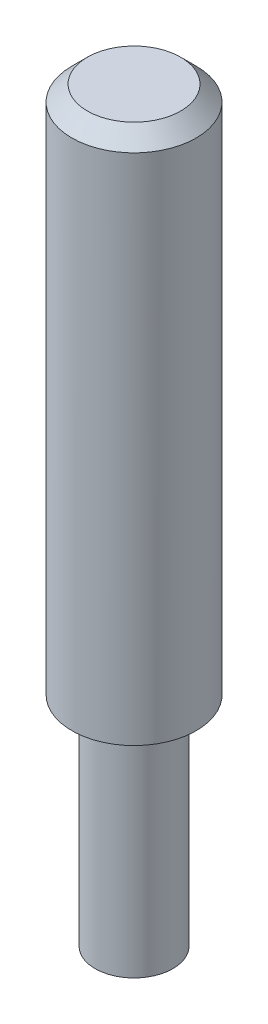
ISO-10303-21;
HEADER;
FILE_DESCRIPTION(('STEP AP214'),'2;1');
FILE_NAME('part.step','',(''),(''),'','','');
FILE_SCHEMA(('AUTOMOTIVE_DESIGN { 1 0 10303 214 1 1 1 1 }'));
ENDSEC;
DATA;
#1=APPLICATION_CONTEXT('core data for automotive mechanical design processes');
#2=APPLICATION_PROTOCOL_DEFINITION('international standard','automotive_design',2000,#1);
#3=PRODUCT_CONTEXT('',#1,'mechanical');
#4=PRODUCT('Part','Part','',(#3));
#5=PRODUCT_RELATED_PRODUCT_CATEGORY('part','',(#4));
#6=PRODUCT_DEFINITION_FORMATION('','',#4);
#7=PRODUCT_DEFINITION_CONTEXT('part definition',#1,'design');
#8=PRODUCT_DEFINITION('design','',#6,#7);
#9=PRODUCT_DEFINITION_SHAPE('','',#8);
#10=(LENGTH_UNIT() NAMED_UNIT(*) SI_UNIT(.MILLI.,.METRE.));
#11=(NAMED_UNIT(*) PLANE_ANGLE_UNIT() SI_UNIT($,.RADIAN.));
#12=(NAMED_UNIT(*) SI_UNIT($,.STERADIAN.) SOLID_ANGLE_UNIT());
#13=UNCERTAINTY_MEASURE_WITH_UNIT(LENGTH_MEASURE(1.E-05),#10,'distance_accuracy_value','');
#14=(GEOMETRIC_REPRESENTATION_CONTEXT(3) GLOBAL_UNCERTAINTY_ASSIGNED_CONTEXT((#13)) GLOBAL_UNIT_ASSIGNED_CONTEXT((#10,
#11,#12)) REPRESENTATION_CONTEXT('',''));
#15=CARTESIAN_POINT('',(0.,0.,0.));
#16=DIRECTION('',(0.,0.,1.));
#17=DIRECTION('',(1.,0.,0.));
#18=AXIS2_PLACEMENT_3D('',#15,#16,#17);
#19=CARTESIAN_POINT('',(0.,24.,0.));
#20=DIRECTION('',(0.,-1.,0.));
#21=DIRECTION('',(0.,0.,-1.));
#22=AXIS2_PLACEMENT_3D('',#19,#20,#21);
#23=CYLINDRICAL_SURFACE('',#22,4.);
#24=CARTESIAN_POINT('',(0.,23.,0.));
#25=DIRECTION('',(0.,1.,0.));
#26=DIRECTION('',(0.,0.,1.));
#27=AXIS2_PLACEMENT_3D('',#24,#25,#26);
#28=CIRCLE('',#27,4.);
#29=CARTESIAN_POINT('',(0.,23.,4.));
#30=VERTEX_POINT('',#29);
#31=EDGE_CURVE('E10',#30,#30,#28,.F.);
#32=ORIENTED_EDGE('',*,*,#31,.T.);
#33=EDGE_LOOP('',(#32));
#34=FACE_BOUND('',#33,.T.);
#35=CARTESIAN_POINT('',(0.,-10.,0.));
#36=DIRECTION('',(0.,-1.,0.));
#37=DIRECTION('',(0.,0.,-1.));
#38=AXIS2_PLACEMENT_3D('',#35,#36,#37);
#39=CIRCLE('',#38,4.);
#40=CARTESIAN_POINT('',(0.,-10.,-4.));
#41=VERTEX_POINT('',#40);
#42=EDGE_CURVE('E51',#41,#41,#39,.T.);
#43=ORIENTED_EDGE('',*,*,#42,.F.);
#44=EDGE_LOOP('',(#43));
#45=FACE_BOUND('',#44,.T.);
#46=ADVANCED_FACE('F39',(#34,#45),#23,.T.);
#47=CARTESIAN_POINT('',(0.,24.,0.));
#48=DIRECTION('',(0.,1.,0.));
#49=DIRECTION('',(0.,0.,1.));
#50=AXIS2_PLACEMENT_3D('',#47,#48,#49);
#51=PLANE('',#50);
#52=CARTESIAN_POINT('',(0.,24.,0.));
#53=DIRECTION('',(0.,1.,0.));
#54=DIRECTION('',(0.,0.,1.));
#55=AXIS2_PLACEMENT_3D('',#52,#53,#54);
#56=CIRCLE('',#55,3.);
#57=CARTESIAN_POINT('',(0.,24.,3.));
#58=VERTEX_POINT('',#57);
#59=EDGE_CURVE('E47',#58,#58,#56,.T.);
#60=ORIENTED_EDGE('',*,*,#59,.T.);
#61=EDGE_LOOP('',(#60));
#62=FACE_BOUND('',#61,.T.);
#63=ADVANCED_FACE('F75',(#62),#51,.T.);
#64=CARTESIAN_POINT('',(0.,-10.,0.));
#65=DIRECTION('',(0.,-1.,0.));
#66=DIRECTION('',(0.,0.,-1.));
#67=AXIS2_PLACEMENT_3D('',#64,#65,#66);
#68=CYLINDRICAL_SURFACE('',#67,2.5);
#69=CARTESIAN_POINT('',(0.,-10.,0.));
#70=DIRECTION('',(0.,-1.,0.));
#71=DIRECTION('',(0.,0.,-1.));
#72=AXIS2_PLACEMENT_3D('',#69,#70,#71);
#73=CIRCLE('',#72,2.5);
#74=CARTESIAN_POINT('',(0.,-10.,-2.5));
#75=VERTEX_POINT('',#74);
#76=EDGE_CURVE('E55',#75,#75,#73,.T.);
#77=ORIENTED_EDGE('',*,*,#76,.T.);
#78=EDGE_LOOP('',(#77));
#79=FACE_BOUND('',#78,.T.);
#80=CARTESIAN_POINT('',(0.,-24.,0.));
#81=DIRECTION('',(0.,-1.,0.));
#82=DIRECTION('',(0.,0.,-1.));
#83=AXIS2_PLACEMENT_3D('',#80,#81,#82);
#84=CIRCLE('',#83,2.5);
#85=CARTESIAN_POINT('',(0.,-24.,-2.5));
#86=VERTEX_POINT('',#85);
#87=EDGE_CURVE('E58',#86,#86,#84,.T.);
#88=ORIENTED_EDGE('',*,*,#87,.F.);
#89=EDGE_LOOP('',(#88));
#90=FACE_BOUND('',#89,.T.);
#91=ADVANCED_FACE('F64',(#79,#90),#68,.T.);
#92=CARTESIAN_POINT('',(0.,-10.,0.));
#93=DIRECTION('',(0.,-1.,0.));
#94=DIRECTION('',(0.,0.,-1.));
#95=AXIS2_PLACEMENT_3D('',#92,#93,#94);
#96=PLANE('',#95);
#97=ORIENTED_EDGE('',*,*,#76,.F.);
#98=EDGE_LOOP('',(#97));
#99=FACE_BOUND('',#98,.T.);
#100=ORIENTED_EDGE('',*,*,#42,.T.);
#101=EDGE_LOOP('',(#100));
#102=FACE_BOUND('',#101,.T.);
#103=ADVANCED_FACE('F67',(#99,#102),#96,.T.);
#104=CARTESIAN_POINT('',(0.,-24.,0.));
#105=DIRECTION('',(0.,1.,0.));
#106=DIRECTION('',(0.,0.,1.));
#107=AXIS2_PLACEMENT_3D('',#104,#105,#106);
#108=PLANE('',#107);
#109=ORIENTED_EDGE('',*,*,#87,.T.);
#110=EDGE_LOOP('',(#109));
#111=FACE_BOUND('',#110,.T.);
#112=ADVANCED_FACE('F70',(#111),#108,.F.);
#113=CARTESIAN_POINT('',(0.,24.,0.));
#114=DIRECTION('',(0.,-1.,0.));
#115=DIRECTION('',(0.,0.,-1.));
#116=AXIS2_PLACEMENT_3D('',#113,#114,#115);
#117=CONICAL_SURFACE('',#116,3.,0.785398163397445);
#118=ORIENTED_EDGE('',*,*,#31,.F.);
#119=EDGE_LOOP('',(#118));
#120=FACE_BOUND('',#119,.T.);
#121=ORIENTED_EDGE('',*,*,#59,.F.);
#122=EDGE_LOOP('',(#121));
#123=FACE_BOUND('',#122,.T.);
#124=ADVANCED_FACE('F42',(#120,#123),#117,.T.);
#125=CLOSED_SHELL('',(#46,#63,#91,#103,#112,#124));
#126=MANIFOLD_SOLID_BREP('B2',#125);
#127=ADVANCED_BREP_SHAPE_REPRESENTATION('',(#18,#126),#14);
#128=SHAPE_DEFINITION_REPRESENTATION(#9,#127);
ENDSEC;
END-ISO-10303-21;
